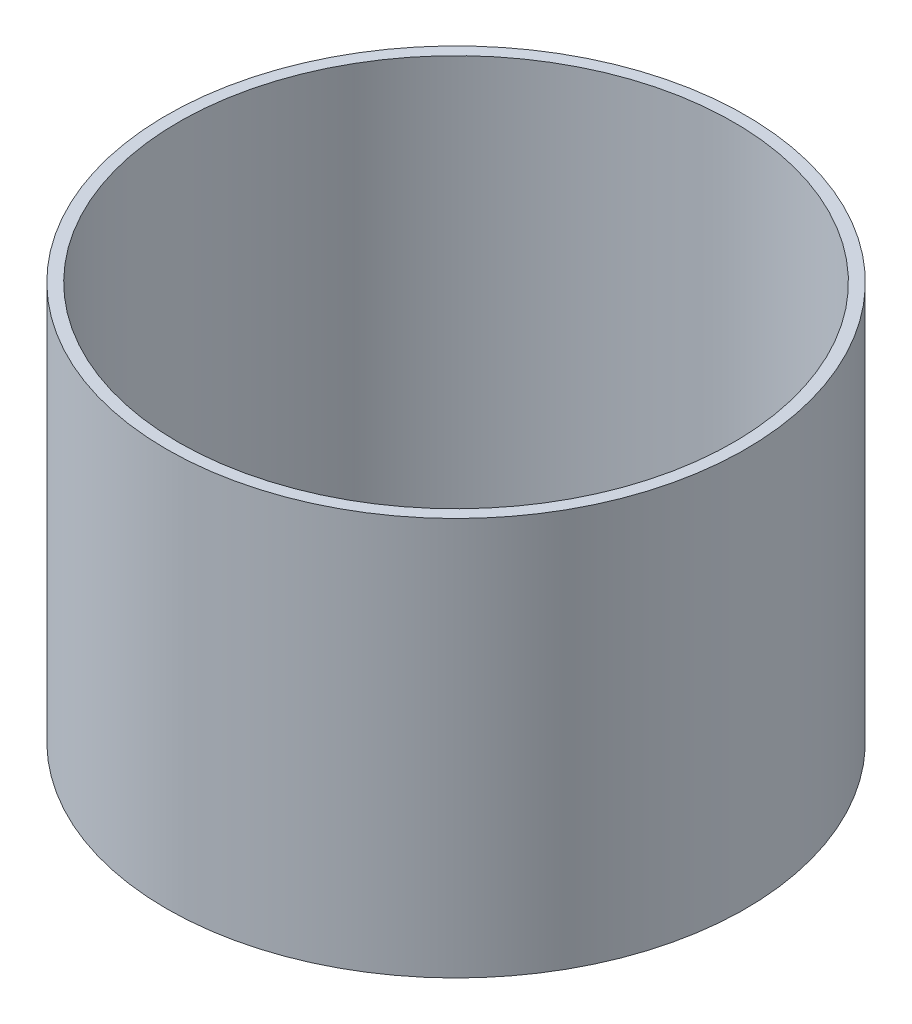
ISO-10303-21;
HEADER;
FILE_DESCRIPTION(('STEP AP214'),'2;1');
FILE_NAME('part.step','',(''),(''),'','','');
FILE_SCHEMA(('AUTOMOTIVE_DESIGN { 1 0 10303 214 1 1 1 1 }'));
ENDSEC;
DATA;
#1=APPLICATION_CONTEXT('core data for automotive mechanical design processes');
#2=APPLICATION_PROTOCOL_DEFINITION('international standard','automotive_design',2000,#1);
#3=PRODUCT_CONTEXT('',#1,'mechanical');
#4=PRODUCT('Part','Part','',(#3));
#5=PRODUCT_RELATED_PRODUCT_CATEGORY('part','',(#4));
#6=PRODUCT_DEFINITION_FORMATION('','',#4);
#7=PRODUCT_DEFINITION_CONTEXT('part definition',#1,'design');
#8=PRODUCT_DEFINITION('design','',#6,#7);
#9=PRODUCT_DEFINITION_SHAPE('','',#8);
#10=(LENGTH_UNIT() NAMED_UNIT(*) SI_UNIT(.MILLI.,.METRE.));
#11=(NAMED_UNIT(*) PLANE_ANGLE_UNIT() SI_UNIT($,.RADIAN.));
#12=(NAMED_UNIT(*) SI_UNIT($,.STERADIAN.) SOLID_ANGLE_UNIT());
#13=UNCERTAINTY_MEASURE_WITH_UNIT(LENGTH_MEASURE(1.E-05),#10,'distance_accuracy_value','');
#14=(GEOMETRIC_REPRESENTATION_CONTEXT(3) GLOBAL_UNCERTAINTY_ASSIGNED_CONTEXT((#13)) GLOBAL_UNIT_ASSIGNED_CONTEXT((#10,
#11,#12)) REPRESENTATION_CONTEXT('',''));
#15=CARTESIAN_POINT('',(0.,0.,0.));
#16=DIRECTION('',(0.,0.,1.));
#17=DIRECTION('',(1.,0.,0.));
#18=AXIS2_PLACEMENT_3D('',#15,#16,#17);
#19=CARTESIAN_POINT('',(0.,-110.,0.));
#20=DIRECTION('',(0.,1.,0.));
#21=DIRECTION('',(0.,0.,1.));
#22=AXIS2_PLACEMENT_3D('',#19,#20,#21);
#23=CYLINDRICAL_SURFACE('',#22,80.);
#24=CARTESIAN_POINT('',(0.,-110.,0.));
#25=DIRECTION('',(0.,1.,0.));
#26=DIRECTION('',(0.,0.,1.));
#27=AXIS2_PLACEMENT_3D('',#24,#25,#26);
#28=CIRCLE('',#27,80.);
#29=CARTESIAN_POINT('',(0.,-110.,80.));
#30=VERTEX_POINT('',#29);
#31=EDGE_CURVE('E10',#30,#30,#28,.T.);
#32=ORIENTED_EDGE('',*,*,#31,.T.);
#33=EDGE_LOOP('',(#32));
#34=FACE_BOUND('',#33,.T.);
#35=CARTESIAN_POINT('',(0.,0.,0.));
#36=DIRECTION('',(0.,1.,0.));
#37=DIRECTION('',(0.,0.,1.));
#38=AXIS2_PLACEMENT_3D('',#35,#36,#37);
#39=CIRCLE('',#38,80.);
#40=CARTESIAN_POINT('',(0.,0.,80.));
#41=VERTEX_POINT('',#40);
#42=EDGE_CURVE('E38',#41,#41,#39,.T.);
#43=ORIENTED_EDGE('',*,*,#42,.F.);
#44=EDGE_LOOP('',(#43));
#45=FACE_BOUND('',#44,.T.);
#46=ADVANCED_FACE('F35',(#34,#45),#23,.T.);
#47=CARTESIAN_POINT('',(0.,-110.,0.));
#48=DIRECTION('',(0.,1.,0.));
#49=DIRECTION('',(0.,0.,1.));
#50=AXIS2_PLACEMENT_3D('',#47,#48,#49);
#51=PLANE('',#50);
#52=CARTESIAN_POINT('',(0.,-110.,0.));
#53=DIRECTION('',(0.,1.,0.));
#54=DIRECTION('',(0.,0.,1.));
#55=AXIS2_PLACEMENT_3D('',#52,#53,#54);
#56=CIRCLE('',#55,76.7);
#57=CARTESIAN_POINT('',(0.,-110.,76.7));
#58=VERTEX_POINT('',#57);
#59=EDGE_CURVE('E45',#58,#58,#56,.T.);
#60=ORIENTED_EDGE('',*,*,#59,.T.);
#61=EDGE_LOOP('',(#60));
#62=FACE_BOUND('',#61,.T.);
#63=ORIENTED_EDGE('',*,*,#31,.F.);
#64=EDGE_LOOP('',(#63));
#65=FACE_BOUND('',#64,.T.);
#66=ADVANCED_FACE('F53',(#62,#65),#51,.F.);
#67=CARTESIAN_POINT('',(0.,0.,0.));
#68=DIRECTION('',(0.,1.,0.));
#69=DIRECTION('',(0.,0.,1.));
#70=AXIS2_PLACEMENT_3D('',#67,#68,#69);
#71=PLANE('',#70);
#72=CARTESIAN_POINT('',(0.,0.,0.));
#73=DIRECTION('',(0.,1.,0.));
#74=DIRECTION('',(0.,0.,1.));
#75=AXIS2_PLACEMENT_3D('',#72,#73,#74);
#76=CIRCLE('',#75,76.7);
#77=CARTESIAN_POINT('',(0.,0.,76.7));
#78=VERTEX_POINT('',#77);
#79=EDGE_CURVE('E47',#78,#78,#76,.T.);
#80=ORIENTED_EDGE('',*,*,#79,.F.);
#81=EDGE_LOOP('',(#80));
#82=FACE_BOUND('',#81,.T.);
#83=ORIENTED_EDGE('',*,*,#42,.T.);
#84=EDGE_LOOP('',(#83));
#85=FACE_BOUND('',#84,.T.);
#86=ADVANCED_FACE('F59',(#82,#85),#71,.T.);
#87=CARTESIAN_POINT('',(0.,-110.,0.));
#88=DIRECTION('',(0.,1.,0.));
#89=DIRECTION('',(0.,0.,1.));
#90=AXIS2_PLACEMENT_3D('',#87,#88,#89);
#91=CYLINDRICAL_SURFACE('',#90,76.7);
#92=ORIENTED_EDGE('',*,*,#59,.F.);
#93=EDGE_LOOP('',(#92));
#94=FACE_BOUND('',#93,.T.);
#95=ORIENTED_EDGE('',*,*,#79,.T.);
#96=EDGE_LOOP('',(#95));
#97=FACE_BOUND('',#96,.T.);
#98=ADVANCED_FACE('F56',(#94,#97),#91,.F.);
#99=CLOSED_SHELL('',(#46,#66,#86,#98));
#100=MANIFOLD_SOLID_BREP('B2',#99);
#101=ADVANCED_BREP_SHAPE_REPRESENTATION('',(#18,#100),#14);
#102=SHAPE_DEFINITION_REPRESENTATION(#9,#101);
ENDSEC;
END-ISO-10303-21;
